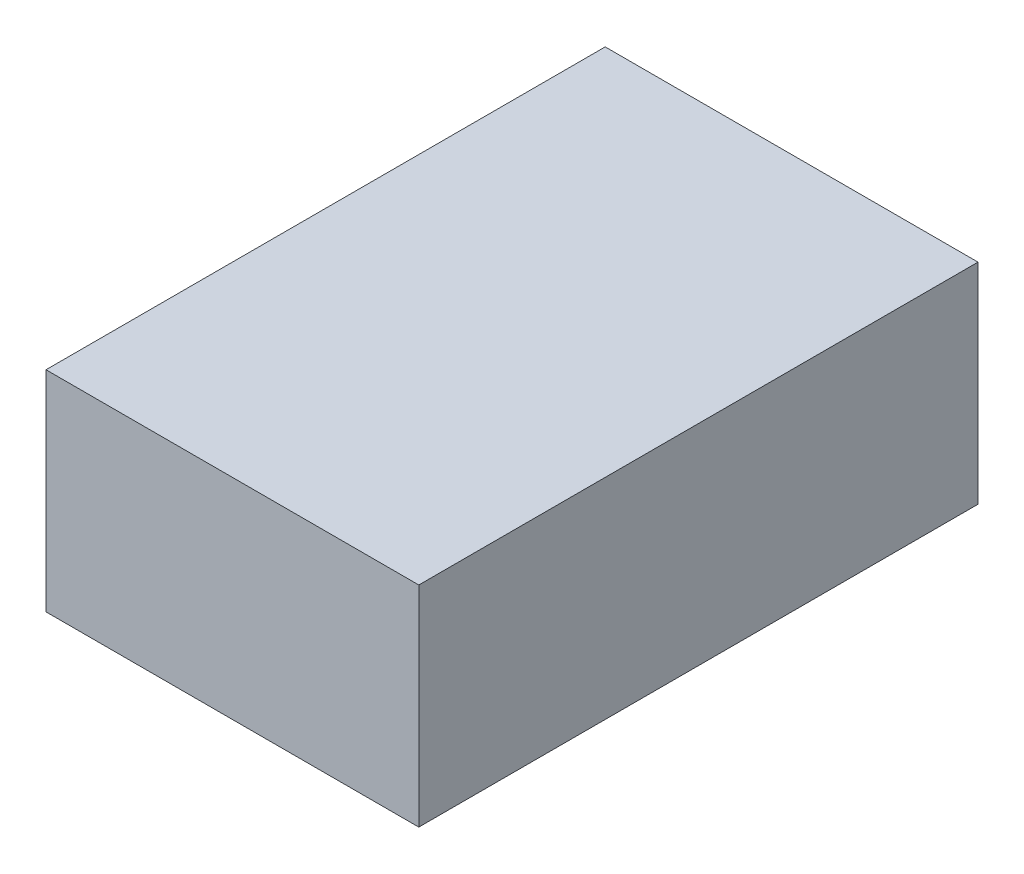
ISO-10303-21;
HEADER;
FILE_DESCRIPTION(('STEP AP214'),'2;1');
FILE_NAME('part.step','',(''),(''),'','','');
FILE_SCHEMA(('AUTOMOTIVE_DESIGN { 1 0 10303 214 1 1 1 1 }'));
ENDSEC;
DATA;
#1=APPLICATION_CONTEXT('core data for automotive mechanical design processes');
#2=APPLICATION_PROTOCOL_DEFINITION('international standard','automotive_design',2000,#1);
#3=PRODUCT_CONTEXT('',#1,'mechanical');
#4=PRODUCT('Part','Part','',(#3));
#5=PRODUCT_RELATED_PRODUCT_CATEGORY('part','',(#4));
#6=PRODUCT_DEFINITION_FORMATION('','',#4);
#7=PRODUCT_DEFINITION_CONTEXT('part definition',#1,'design');
#8=PRODUCT_DEFINITION('design','',#6,#7);
#9=PRODUCT_DEFINITION_SHAPE('','',#8);
#10=(LENGTH_UNIT() NAMED_UNIT(*) SI_UNIT(.MILLI.,.METRE.));
#11=(NAMED_UNIT(*) PLANE_ANGLE_UNIT() SI_UNIT($,.RADIAN.));
#12=(NAMED_UNIT(*) SI_UNIT($,.STERADIAN.) SOLID_ANGLE_UNIT());
#13=UNCERTAINTY_MEASURE_WITH_UNIT(LENGTH_MEASURE(1.E-05),#10,'distance_accuracy_value','');
#14=(GEOMETRIC_REPRESENTATION_CONTEXT(3) GLOBAL_UNCERTAINTY_ASSIGNED_CONTEXT((#13)) GLOBAL_UNIT_ASSIGNED_CONTEXT((#10,
#11,#12)) REPRESENTATION_CONTEXT('',''));
#15=CARTESIAN_POINT('',(0.,0.,0.));
#16=DIRECTION('',(0.,0.,1.));
#17=DIRECTION('',(1.,0.,0.));
#18=AXIS2_PLACEMENT_3D('',#15,#16,#17);
#19=CARTESIAN_POINT('',(25.4,-14.2875,-76.2));
#20=DIRECTION('',(1.,0.,0.));
#21=DIRECTION('',(0.,0.,-1.));
#22=AXIS2_PLACEMENT_3D('',#19,#20,#21);
#23=PLANE('',#22);
#24=DIRECTION('',(0.,1.,0.));
#25=VECTOR('',#24,1.);
#26=CARTESIAN_POINT('',(25.4,-14.2875,0.));
#27=LINE('',#26,#25);
#28=CARTESIAN_POINT('',(25.4,-14.2875,0.));
#29=VERTEX_POINT('',#28);
#30=CARTESIAN_POINT('',(25.4,14.2875,0.));
#31=VERTEX_POINT('',#30);
#32=EDGE_CURVE('E115',#29,#31,#27,.T.);
#33=ORIENTED_EDGE('',*,*,#32,.F.);
#34=DIRECTION('',(0.,0.,1.));
#35=VECTOR('',#34,1.);
#36=CARTESIAN_POINT('',(25.4,-14.2875,-76.2));
#37=LINE('',#36,#35);
#38=CARTESIAN_POINT('',(25.4,-14.2875,-76.2));
#39=VERTEX_POINT('',#38);
#40=EDGE_CURVE('E11',#39,#29,#37,.T.);
#41=ORIENTED_EDGE('',*,*,#40,.F.);
#42=DIRECTION('',(0.,1.,0.));
#43=VECTOR('',#42,1.);
#44=CARTESIAN_POINT('',(25.4,-14.2875,-76.2));
#45=LINE('',#44,#43);
#46=CARTESIAN_POINT('',(25.4,14.2875,-76.2));
#47=VERTEX_POINT('',#46);
#48=EDGE_CURVE('E107',#39,#47,#45,.T.);
#49=ORIENTED_EDGE('',*,*,#48,.T.);
#50=DIRECTION('',(0.,0.,1.));
#51=VECTOR('',#50,1.);
#52=CARTESIAN_POINT('',(25.4,14.2875,-76.2));
#53=LINE('',#52,#51);
#54=EDGE_CURVE('E48',#47,#31,#53,.T.);
#55=ORIENTED_EDGE('',*,*,#54,.T.);
#56=EDGE_LOOP('',(#33,#41,#49,#55));
#57=FACE_BOUND('',#56,.T.);
#58=ADVANCED_FACE('F45',(#57),#23,.T.);
#59=CARTESIAN_POINT('',(-25.4,-14.2875,-76.2));
#60=DIRECTION('',(0.,-1.,0.));
#61=DIRECTION('',(0.,0.,-1.));
#62=AXIS2_PLACEMENT_3D('',#59,#60,#61);
#63=PLANE('',#62);
#64=DIRECTION('',(1.,0.,0.));
#65=VECTOR('',#64,1.);
#66=CARTESIAN_POINT('',(-25.4,-14.2875,0.));
#67=LINE('',#66,#65);
#68=CARTESIAN_POINT('',(-25.4,-14.2875,0.));
#69=VERTEX_POINT('',#68);
#70=EDGE_CURVE('E110',#69,#29,#67,.T.);
#71=ORIENTED_EDGE('',*,*,#70,.F.);
#72=DIRECTION('',(0.,0.,1.));
#73=VECTOR('',#72,1.);
#74=CARTESIAN_POINT('',(-25.4,-14.2875,-76.2));
#75=LINE('',#74,#73);
#76=CARTESIAN_POINT('',(-25.4,-14.2875,-76.2));
#77=VERTEX_POINT('',#76);
#78=EDGE_CURVE('E55',#77,#69,#75,.T.);
#79=ORIENTED_EDGE('',*,*,#78,.F.);
#80=DIRECTION('',(1.,0.,0.));
#81=VECTOR('',#80,1.);
#82=CARTESIAN_POINT('',(-25.4,-14.2875,-76.2));
#83=LINE('',#82,#81);
#84=EDGE_CURVE('E102',#77,#39,#83,.T.);
#85=ORIENTED_EDGE('',*,*,#84,.T.);
#86=ORIENTED_EDGE('',*,*,#40,.T.);
#87=EDGE_LOOP('',(#71,#79,#85,#86));
#88=FACE_BOUND('',#87,.T.);
#89=ADVANCED_FACE('F131',(#88),#63,.T.);
#90=CARTESIAN_POINT('',(-25.4,-14.2875,-76.2));
#91=DIRECTION('',(-1.,0.,0.));
#92=DIRECTION('',(0.,0.,1.));
#93=AXIS2_PLACEMENT_3D('',#90,#91,#92);
#94=PLANE('',#93);
#95=DIRECTION('',(0.,-1.,0.));
#96=VECTOR('',#95,1.);
#97=CARTESIAN_POINT('',(-25.4,-14.2875,0.));
#98=LINE('',#97,#96);
#99=CARTESIAN_POINT('',(-25.4,14.2875,0.));
#100=VERTEX_POINT('',#99);
#101=EDGE_CURVE('E96',#100,#69,#98,.T.);
#102=ORIENTED_EDGE('',*,*,#101,.F.);
#103=DIRECTION('',(0.,0.,1.));
#104=VECTOR('',#103,1.);
#105=CARTESIAN_POINT('',(-25.4,14.2875,-76.2));
#106=LINE('',#105,#104);
#107=CARTESIAN_POINT('',(-25.4,14.2875,-76.2));
#108=VERTEX_POINT('',#107);
#109=EDGE_CURVE('E91',#108,#100,#106,.T.);
#110=ORIENTED_EDGE('',*,*,#109,.F.);
#111=DIRECTION('',(0.,-1.,0.));
#112=VECTOR('',#111,1.);
#113=CARTESIAN_POINT('',(-25.4,-14.2875,-76.2));
#114=LINE('',#113,#112);
#115=EDGE_CURVE('E94',#108,#77,#114,.T.);
#116=ORIENTED_EDGE('',*,*,#115,.T.);
#117=ORIENTED_EDGE('',*,*,#78,.T.);
#118=EDGE_LOOP('',(#102,#110,#116,#117));
#119=FACE_BOUND('',#118,.T.);
#120=ADVANCED_FACE('F93',(#119),#94,.T.);
#121=CARTESIAN_POINT('',(-25.4,14.2875,-76.2));
#122=DIRECTION('',(0.,1.,0.));
#123=DIRECTION('',(0.,0.,1.));
#124=AXIS2_PLACEMENT_3D('',#121,#122,#123);
#125=PLANE('',#124);
#126=DIRECTION('',(-1.,0.,0.));
#127=VECTOR('',#126,1.);
#128=CARTESIAN_POINT('',(-25.4,14.2875,0.));
#129=LINE('',#128,#127);
#130=EDGE_CURVE('E119',#31,#100,#129,.T.);
#131=ORIENTED_EDGE('',*,*,#130,.F.);
#132=ORIENTED_EDGE('',*,*,#54,.F.);
#133=DIRECTION('',(-1.,0.,0.));
#134=VECTOR('',#133,1.);
#135=CARTESIAN_POINT('',(-25.4,14.2875,-76.2));
#136=LINE('',#135,#134);
#137=EDGE_CURVE('E101',#47,#108,#136,.T.);
#138=ORIENTED_EDGE('',*,*,#137,.T.);
#139=ORIENTED_EDGE('',*,*,#109,.T.);
#140=EDGE_LOOP('',(#131,#132,#138,#139));
#141=FACE_BOUND('',#140,.T.);
#142=ADVANCED_FACE('F105',(#141),#125,.T.);
#143=CARTESIAN_POINT('',(0.,0.,-76.2));
#144=DIRECTION('',(0.,0.,-1.));
#145=DIRECTION('',(-1.,0.,0.));
#146=AXIS2_PLACEMENT_3D('',#143,#144,#145);
#147=PLANE('',#146);
#148=ORIENTED_EDGE('',*,*,#48,.F.);
#149=ORIENTED_EDGE('',*,*,#84,.F.);
#150=ORIENTED_EDGE('',*,*,#115,.F.);
#151=ORIENTED_EDGE('',*,*,#137,.F.);
#152=EDGE_LOOP('',(#148,#149,#150,#151));
#153=FACE_BOUND('',#152,.T.);
#154=ADVANCED_FACE('F100',(#153),#147,.T.);
#155=CARTESIAN_POINT('',(0.,0.,0.));
#156=DIRECTION('',(0.,0.,-1.));
#157=DIRECTION('',(-1.,0.,0.));
#158=AXIS2_PLACEMENT_3D('',#155,#156,#157);
#159=PLANE('',#158);
#160=ORIENTED_EDGE('',*,*,#32,.T.);
#161=ORIENTED_EDGE('',*,*,#130,.T.);
#162=ORIENTED_EDGE('',*,*,#101,.T.);
#163=ORIENTED_EDGE('',*,*,#70,.T.);
#164=EDGE_LOOP('',(#160,#161,#162,#163));
#165=FACE_BOUND('',#164,.T.);
#166=ADVANCED_FACE('F130',(#165),#159,.F.);
#167=CLOSED_SHELL('',(#58,#89,#120,#142,#154,#166));
#168=MANIFOLD_SOLID_BREP('B2',#167);
#169=ADVANCED_BREP_SHAPE_REPRESENTATION('',(#18,#168),#14);
#170=SHAPE_DEFINITION_REPRESENTATION(#9,#169);
ENDSEC;
END-ISO-10303-21;
